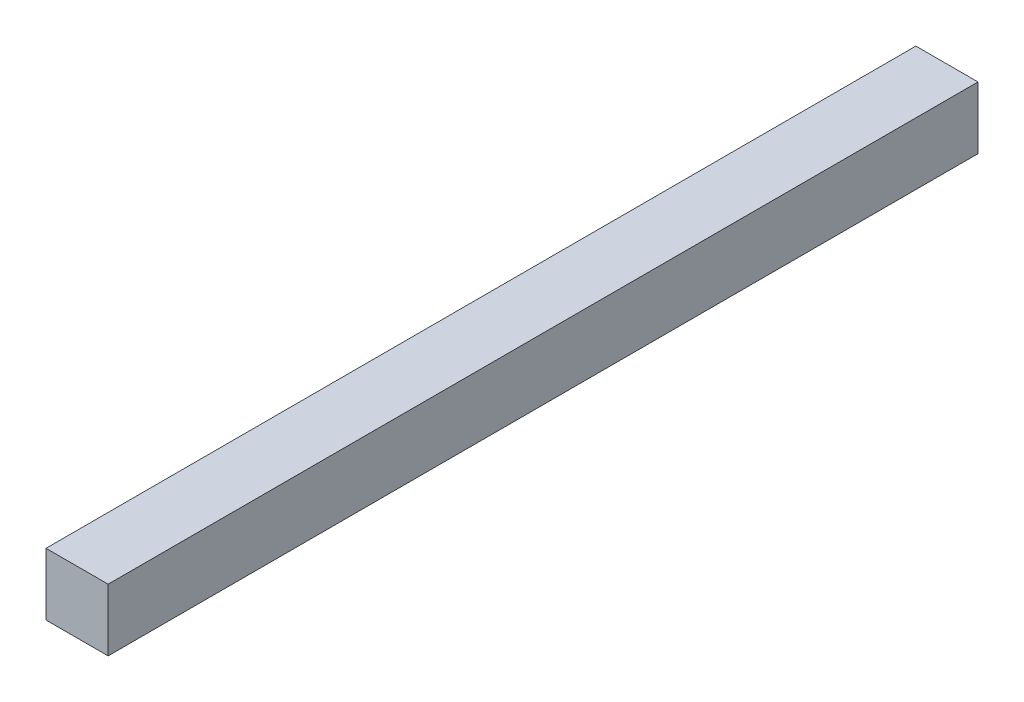
ISO-10303-21;
HEADER;
FILE_DESCRIPTION(('STEP AP214'),'2;1');
FILE_NAME('part.step','',(''),(''),'','','');
FILE_SCHEMA(('AUTOMOTIVE_DESIGN { 1 0 10303 214 1 1 1 1 }'));
ENDSEC;
DATA;
#1=APPLICATION_CONTEXT('core data for automotive mechanical design processes');
#2=APPLICATION_PROTOCOL_DEFINITION('international standard','automotive_design',2000,#1);
#3=PRODUCT_CONTEXT('',#1,'mechanical');
#4=PRODUCT('Part','Part','',(#3));
#5=PRODUCT_RELATED_PRODUCT_CATEGORY('part','',(#4));
#6=PRODUCT_DEFINITION_FORMATION('','',#4);
#7=PRODUCT_DEFINITION_CONTEXT('part definition',#1,'design');
#8=PRODUCT_DEFINITION('design','',#6,#7);
#9=PRODUCT_DEFINITION_SHAPE('','',#8);
#10=(LENGTH_UNIT() NAMED_UNIT(*) SI_UNIT(.MILLI.,.METRE.));
#11=(NAMED_UNIT(*) PLANE_ANGLE_UNIT() SI_UNIT($,.RADIAN.));
#12=(NAMED_UNIT(*) SI_UNIT($,.STERADIAN.) SOLID_ANGLE_UNIT());
#13=UNCERTAINTY_MEASURE_WITH_UNIT(LENGTH_MEASURE(1.E-05),#10,'distance_accuracy_value','');
#14=(GEOMETRIC_REPRESENTATION_CONTEXT(3) GLOBAL_UNCERTAINTY_ASSIGNED_CONTEXT((#13)) GLOBAL_UNIT_ASSIGNED_CONTEXT((#10,
#11,#12)) REPRESENTATION_CONTEXT('',''));
#15=CARTESIAN_POINT('',(0.,0.,0.));
#16=DIRECTION('',(0.,0.,1.));
#17=DIRECTION('',(1.,0.,0.));
#18=AXIS2_PLACEMENT_3D('',#15,#16,#17);
#19=CARTESIAN_POINT('',(0.,0.,133.35));
#20=DIRECTION('',(1.,0.,0.));
#21=DIRECTION('',(0.,0.,-1.));
#22=AXIS2_PLACEMENT_3D('',#19,#20,#21);
#23=PLANE('',#22);
#24=DIRECTION('',(0.,-1.,0.));
#25=VECTOR('',#24,1.);
#26=CARTESIAN_POINT('',(0.,0.,0.));
#27=LINE('',#26,#25);
#28=CARTESIAN_POINT('',(0.,9.525,0.));
#29=VERTEX_POINT('',#28);
#30=CARTESIAN_POINT('',(0.,0.,0.));
#31=VERTEX_POINT('',#30);
#32=EDGE_CURVE('E102',#29,#31,#27,.T.);
#33=ORIENTED_EDGE('',*,*,#32,.T.);
#34=DIRECTION('',(0.,0.,-1.));
#35=VECTOR('',#34,1.);
#36=CARTESIAN_POINT('',(0.,0.,133.35));
#37=LINE('',#36,#35);
#38=CARTESIAN_POINT('',(0.,0.,133.35));
#39=VERTEX_POINT('',#38);
#40=EDGE_CURVE('E11',#39,#31,#37,.T.);
#41=ORIENTED_EDGE('',*,*,#40,.F.);
#42=DIRECTION('',(0.,-1.,0.));
#43=VECTOR('',#42,1.);
#44=CARTESIAN_POINT('',(0.,0.,133.35));
#45=LINE('',#44,#43);
#46=CARTESIAN_POINT('',(0.,9.525,133.35));
#47=VERTEX_POINT('',#46);
#48=EDGE_CURVE('E95',#47,#39,#45,.T.);
#49=ORIENTED_EDGE('',*,*,#48,.F.);
#50=DIRECTION('',(0.,0.,-1.));
#51=VECTOR('',#50,1.);
#52=CARTESIAN_POINT('',(0.,9.525,133.35));
#53=LINE('',#52,#51);
#54=EDGE_CURVE('E99',#47,#29,#53,.T.);
#55=ORIENTED_EDGE('',*,*,#54,.T.);
#56=EDGE_LOOP('',(#33,#41,#49,#55));
#57=FACE_BOUND('',#56,.T.);
#58=ADVANCED_FACE('F41',(#57),#23,.F.);
#59=CARTESIAN_POINT('',(0.,0.,133.35));
#60=DIRECTION('',(0.,1.,0.));
#61=DIRECTION('',(0.,0.,1.));
#62=AXIS2_PLACEMENT_3D('',#59,#60,#61);
#63=PLANE('',#62);
#64=DIRECTION('',(1.,0.,0.));
#65=VECTOR('',#64,1.);
#66=CARTESIAN_POINT('',(0.,0.,0.));
#67=LINE('',#66,#65);
#68=CARTESIAN_POINT('',(9.525,0.,0.));
#69=VERTEX_POINT('',#68);
#70=EDGE_CURVE('E96',#31,#69,#67,.T.);
#71=ORIENTED_EDGE('',*,*,#70,.T.);
#72=DIRECTION('',(0.,0.,-1.));
#73=VECTOR('',#72,1.);
#74=CARTESIAN_POINT('',(9.525,0.,133.35));
#75=LINE('',#74,#73);
#76=CARTESIAN_POINT('',(9.525,0.,133.35));
#77=VERTEX_POINT('',#76);
#78=EDGE_CURVE('E47',#77,#69,#75,.T.);
#79=ORIENTED_EDGE('',*,*,#78,.F.);
#80=DIRECTION('',(1.,0.,0.));
#81=VECTOR('',#80,1.);
#82=CARTESIAN_POINT('',(0.,0.,133.35));
#83=LINE('',#82,#81);
#84=EDGE_CURVE('E87',#39,#77,#83,.T.);
#85=ORIENTED_EDGE('',*,*,#84,.F.);
#86=ORIENTED_EDGE('',*,*,#40,.T.);
#87=EDGE_LOOP('',(#71,#79,#85,#86));
#88=FACE_BOUND('',#87,.T.);
#89=ADVANCED_FACE('F92',(#88),#63,.F.);
#90=CARTESIAN_POINT('',(9.525,0.,133.35));
#91=DIRECTION('',(-1.,0.,0.));
#92=DIRECTION('',(0.,0.,1.));
#93=AXIS2_PLACEMENT_3D('',#90,#91,#92);
#94=PLANE('',#93);
#95=DIRECTION('',(0.,1.,0.));
#96=VECTOR('',#95,1.);
#97=CARTESIAN_POINT('',(9.525,0.,0.));
#98=LINE('',#97,#96);
#99=CARTESIAN_POINT('',(9.525,9.525,0.));
#100=VERTEX_POINT('',#99);
#101=EDGE_CURVE('E74',#69,#100,#98,.T.);
#102=ORIENTED_EDGE('',*,*,#101,.T.);
#103=DIRECTION('',(0.,0.,-1.));
#104=VECTOR('',#103,1.);
#105=CARTESIAN_POINT('',(9.525,9.525,133.35));
#106=LINE('',#105,#104);
#107=CARTESIAN_POINT('',(9.525,9.525,133.35));
#108=VERTEX_POINT('',#107);
#109=EDGE_CURVE('E100',#108,#100,#106,.T.);
#110=ORIENTED_EDGE('',*,*,#109,.F.);
#111=DIRECTION('',(0.,1.,0.));
#112=VECTOR('',#111,1.);
#113=CARTESIAN_POINT('',(9.525,0.,133.35));
#114=LINE('',#113,#112);
#115=EDGE_CURVE('E89',#77,#108,#114,.T.);
#116=ORIENTED_EDGE('',*,*,#115,.F.);
#117=ORIENTED_EDGE('',*,*,#78,.T.);
#118=EDGE_LOOP('',(#102,#110,#116,#117));
#119=FACE_BOUND('',#118,.T.);
#120=ADVANCED_FACE('F98',(#119),#94,.F.);
#121=CARTESIAN_POINT('',(0.,9.525,133.35));
#122=DIRECTION('',(0.,-1.,0.));
#123=DIRECTION('',(0.,0.,-1.));
#124=AXIS2_PLACEMENT_3D('',#121,#122,#123);
#125=PLANE('',#124);
#126=DIRECTION('',(-1.,0.,0.));
#127=VECTOR('',#126,1.);
#128=CARTESIAN_POINT('',(0.,9.525,0.));
#129=LINE('',#128,#127);
#130=EDGE_CURVE('E78',#100,#29,#129,.T.);
#131=ORIENTED_EDGE('',*,*,#130,.T.);
#132=ORIENTED_EDGE('',*,*,#54,.F.);
#133=DIRECTION('',(-1.,0.,0.));
#134=VECTOR('',#133,1.);
#135=CARTESIAN_POINT('',(0.,9.525,133.35));
#136=LINE('',#135,#134);
#137=EDGE_CURVE('E60',#108,#47,#136,.T.);
#138=ORIENTED_EDGE('',*,*,#137,.F.);
#139=ORIENTED_EDGE('',*,*,#109,.T.);
#140=EDGE_LOOP('',(#131,#132,#138,#139));
#141=FACE_BOUND('',#140,.T.);
#142=ADVANCED_FACE('F112',(#141),#125,.F.);
#143=CARTESIAN_POINT('',(0.,0.,133.35));
#144=DIRECTION('',(0.,0.,-1.));
#145=DIRECTION('',(-1.,0.,0.));
#146=AXIS2_PLACEMENT_3D('',#143,#144,#145);
#147=PLANE('',#146);
#148=ORIENTED_EDGE('',*,*,#48,.T.);
#149=ORIENTED_EDGE('',*,*,#84,.T.);
#150=ORIENTED_EDGE('',*,*,#115,.T.);
#151=ORIENTED_EDGE('',*,*,#137,.T.);
#152=EDGE_LOOP('',(#148,#149,#150,#151));
#153=FACE_BOUND('',#152,.T.);
#154=ADVANCED_FACE('F86',(#153),#147,.F.);
#155=CARTESIAN_POINT('',(0.,0.,0.));
#156=DIRECTION('',(0.,0.,-1.));
#157=DIRECTION('',(-1.,0.,0.));
#158=AXIS2_PLACEMENT_3D('',#155,#156,#157);
#159=PLANE('',#158);
#160=ORIENTED_EDGE('',*,*,#32,.F.);
#161=ORIENTED_EDGE('',*,*,#130,.F.);
#162=ORIENTED_EDGE('',*,*,#101,.F.);
#163=ORIENTED_EDGE('',*,*,#70,.F.);
#164=EDGE_LOOP('',(#160,#161,#162,#163));
#165=FACE_BOUND('',#164,.T.);
#166=ADVANCED_FACE('F111',(#165),#159,.T.);
#167=CLOSED_SHELL('',(#58,#89,#120,#142,#154,#166));
#168=MANIFOLD_SOLID_BREP('B2',#167);
#169=ADVANCED_BREP_SHAPE_REPRESENTATION('',(#18,#168),#14);
#170=SHAPE_DEFINITION_REPRESENTATION(#9,#169);
ENDSEC;
END-ISO-10303-21;
